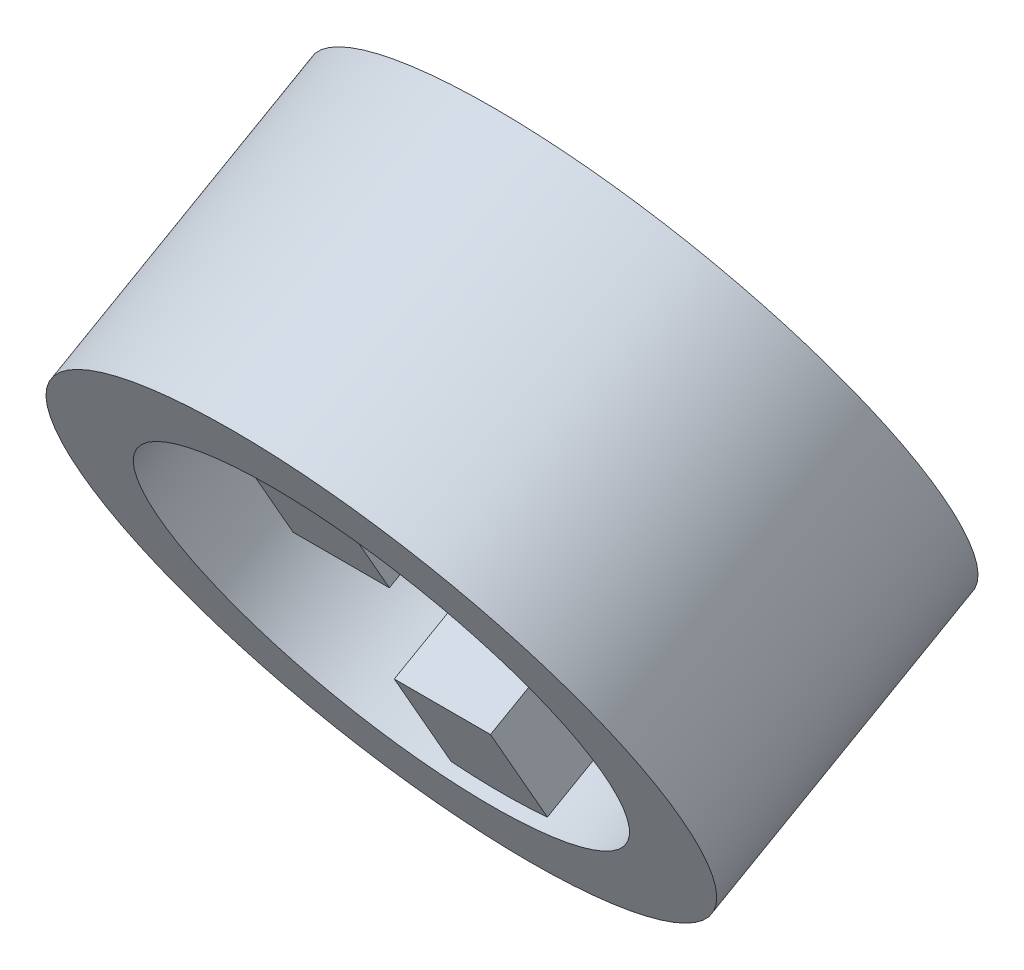
ISO-10303-21;
HEADER;
FILE_DESCRIPTION(('STEP AP214'),'2;1');
FILE_NAME('part.step','',(''),(''),'','','');
FILE_SCHEMA(('AUTOMOTIVE_DESIGN { 1 0 10303 214 1 1 1 1 }'));
ENDSEC;
DATA;
#1=APPLICATION_CONTEXT('core data for automotive mechanical design processes');
#2=APPLICATION_PROTOCOL_DEFINITION('international standard','automotive_design',2000,#1);
#3=PRODUCT_CONTEXT('',#1,'mechanical');
#4=PRODUCT('Part','Part','',(#3));
#5=PRODUCT_RELATED_PRODUCT_CATEGORY('part','',(#4));
#6=PRODUCT_DEFINITION_FORMATION('','',#4);
#7=PRODUCT_DEFINITION_CONTEXT('part definition',#1,'design');
#8=PRODUCT_DEFINITION('design','',#6,#7);
#9=PRODUCT_DEFINITION_SHAPE('','',#8);
#10=(LENGTH_UNIT() NAMED_UNIT(*) SI_UNIT(.MILLI.,.METRE.));
#11=(NAMED_UNIT(*) PLANE_ANGLE_UNIT() SI_UNIT($,.RADIAN.));
#12=(NAMED_UNIT(*) SI_UNIT($,.STERADIAN.) SOLID_ANGLE_UNIT());
#13=UNCERTAINTY_MEASURE_WITH_UNIT(LENGTH_MEASURE(1.E-05),#10,'distance_accuracy_value','');
#14=(GEOMETRIC_REPRESENTATION_CONTEXT(3) GLOBAL_UNCERTAINTY_ASSIGNED_CONTEXT((#13)) GLOBAL_UNIT_ASSIGNED_CONTEXT((#10,
#11,#12)) REPRESENTATION_CONTEXT('',''));
#15=CARTESIAN_POINT('',(0.,0.,0.));
#16=DIRECTION('',(0.,0.,1.));
#17=DIRECTION('',(1.,0.,0.));
#18=AXIS2_PLACEMENT_3D('',#15,#16,#17);
#19=CARTESIAN_POINT('',(-27.75,72.8418629992691,-22.5015725902753));
#20=DIRECTION('',(0.,0.494736971942381,-0.869042765687215));
#21=DIRECTION('',(0.,0.869042765687215,0.494736971942381));
#22=AXIS2_PLACEMENT_3D('',#19,#20,#21);
#23=PLANE('',#22);
#24=CARTESIAN_POINT('',(-27.75,72.8418629992691,-22.5015725902753));
#25=DIRECTION('',(0.,0.494736971942381,-0.869042765687215));
#26=DIRECTION('',(0.,0.869042765687215,0.494736971942381));
#27=AXIS2_PLACEMENT_3D('',#24,#25,#26);
#28=CIRCLE('',#27,5.00000000000002);
#29=CARTESIAN_POINT('',(-27.75,77.1870768277051,-20.0278877305634));
#30=VERTEX_POINT('',#29);
#31=EDGE_CURVE('E163',#30,#30,#28,.T.);
#32=ORIENTED_EDGE('',*,*,#31,.T.);
#33=EDGE_LOOP('',(#32));
#34=FACE_BOUND('',#33,.T.);
#35=DIRECTION('',(1.,0.,0.));
#36=VECTOR('',#35,1.);
#37=CARTESIAN_POINT('',(-27.75,71.3644902976009,-23.3426254425773));
#38=LINE('',#37,#36);
#39=CARTESIAN_POINT('',(-28.55,71.3644902976009,-23.3426254425773));
#40=VERTEX_POINT('',#39);
#41=CARTESIAN_POINT('',(-26.9499999999999,71.3644902976009,-23.3426254425773));
#42=VERTEX_POINT('',#41);
#43=EDGE_CURVE('E49',#40,#42,#38,.T.);
#44=ORIENTED_EDGE('',*,*,#43,.T.);
#45=DIRECTION('',(0.,-0.869042765687215,-0.494736971942381));
#46=VECTOR('',#45,1.);
#47=CARTESIAN_POINT('',(-26.9499999999999,72.8418629992691,-22.5015725902753));
#48=LINE('',#47,#46);
#49=CARTESIAN_POINT('',(-26.9499999999999,69.7024648024577,-24.2887992020561));
#50=VERTEX_POINT('',#49);
#51=EDGE_CURVE('E11',#42,#50,#48,.T.);
#52=ORIENTED_EDGE('',*,*,#51,.T.);
#53=CARTESIAN_POINT('',(-27.75,72.8418629992691,-22.5015725902753));
#54=DIRECTION('',(0.,0.494736971942381,-0.869042765687215));
#55=DIRECTION('',(0.,0.869042765687215,0.494736971942381));
#56=AXIS2_PLACEMENT_3D('',#53,#54,#55);
#57=CIRCLE('',#56,3.70000000000001);
#58=CARTESIAN_POINT('',(-26.9499999999999,75.9812611960804,-20.7143459784944));
#59=VERTEX_POINT('',#58);
#60=EDGE_CURVE('E64',#59,#50,#57,.T.);
#61=ORIENTED_EDGE('',*,*,#60,.F.);
#62=DIRECTION('',(0.,-0.869042765687215,-0.494736971942381));
#63=VECTOR('',#62,1.);
#64=CARTESIAN_POINT('',(-26.9499999999999,72.8418629992691,-22.5015725902753));
#65=LINE('',#64,#63);
#66=CARTESIAN_POINT('',(-26.9499999999999,74.3192357009374,-21.6605197379732));
#67=VERTEX_POINT('',#66);
#68=EDGE_CURVE('E167',#59,#67,#65,.T.);
#69=ORIENTED_EDGE('',*,*,#68,.T.);
#70=DIRECTION('',(-1.,0.,0.));
#71=VECTOR('',#70,1.);
#72=CARTESIAN_POINT('',(-27.75,74.3192357009374,-21.6605197379732));
#73=LINE('',#72,#71);
#74=CARTESIAN_POINT('',(-28.55,74.3192357009374,-21.6605197379732));
#75=VERTEX_POINT('',#74);
#76=EDGE_CURVE('E172',#67,#75,#73,.T.);
#77=ORIENTED_EDGE('',*,*,#76,.T.);
#78=DIRECTION('',(0.,0.869042765687215,0.494736971942381));
#79=VECTOR('',#78,1.);
#80=CARTESIAN_POINT('',(-28.55,72.8418629992691,-22.5015725902753));
#81=LINE('',#80,#79);
#82=CARTESIAN_POINT('',(-28.55,75.9812611960804,-20.7143459784944));
#83=VERTEX_POINT('',#82);
#84=EDGE_CURVE('E175',#75,#83,#81,.T.);
#85=ORIENTED_EDGE('',*,*,#84,.T.);
#86=CARTESIAN_POINT('',(-28.55,69.7024648024577,-24.2887992020561));
#87=VERTEX_POINT('',#86);
#88=EDGE_CURVE('E115',#87,#83,#57,.T.);
#89=ORIENTED_EDGE('',*,*,#88,.F.);
#90=DIRECTION('',(0.,0.869042765687215,0.494736971942381));
#91=VECTOR('',#90,1.);
#92=CARTESIAN_POINT('',(-28.55,72.8418629992691,-22.5015725902753));
#93=LINE('',#92,#91);
#94=EDGE_CURVE('E178',#87,#40,#93,.T.);
#95=ORIENTED_EDGE('',*,*,#94,.T.);
#96=EDGE_LOOP('',(#44,#52,#61,#69,#77,#85,#89,#95));
#97=FACE_BOUND('',#96,.T.);
#98=ADVANCED_FACE('F41',(#34,#97),#23,.T.);
#99=CARTESIAN_POINT('',(-27.75,70.3681781395572,-18.1563587618392));
#100=DIRECTION('',(0.,0.494736971942381,-0.869042765687215));
#101=DIRECTION('',(0.,0.869042765687215,0.494736971942381));
#102=AXIS2_PLACEMENT_3D('',#99,#100,#101);
#103=CYLINDRICAL_SURFACE('',#102,5.00000000000002);
#104=CARTESIAN_POINT('',(-27.75,70.3681781395572,-18.1563587618392));
#105=DIRECTION('',(0.,0.494736971942381,-0.869042765687215));
#106=DIRECTION('',(0.,0.869042765687215,0.494736971942381));
#107=AXIS2_PLACEMENT_3D('',#104,#105,#106);
#108=CIRCLE('',#107,5.00000000000002);
#109=CARTESIAN_POINT('',(-27.75,74.7133919679932,-15.6826739021273));
#110=VERTEX_POINT('',#109);
#111=EDGE_CURVE('E164',#110,#110,#108,.T.);
#112=ORIENTED_EDGE('',*,*,#111,.T.);
#113=EDGE_LOOP('',(#112));
#114=FACE_BOUND('',#113,.T.);
#115=ORIENTED_EDGE('',*,*,#31,.F.);
#116=EDGE_LOOP('',(#115));
#117=FACE_BOUND('',#116,.T.);
#118=ADVANCED_FACE('F43',(#114,#117),#103,.T.);
#119=CARTESIAN_POINT('',(-27.75,70.3681781395572,-18.1563587618392));
#120=DIRECTION('',(0.,0.494736971942381,-0.869042765687215));
#121=DIRECTION('',(0.,0.869042765687215,0.494736971942381));
#122=AXIS2_PLACEMENT_3D('',#119,#120,#121);
#123=PLANE('',#122);
#124=CARTESIAN_POINT('',(-27.75,70.3681781395572,-18.1563587618392));
#125=DIRECTION('',(0.,0.494736971942381,-0.869042765687215));
#126=DIRECTION('',(0.,0.869042765687215,0.494736971942381));
#127=AXIS2_PLACEMENT_3D('',#124,#125,#126);
#128=CIRCLE('',#127,3.70000000000001);
#129=CARTESIAN_POINT('',(-27.75,73.5836363725999,-16.3258319656524));
#130=VERTEX_POINT('',#129);
#131=EDGE_CURVE('E118',#130,#130,#128,.T.);
#132=ORIENTED_EDGE('',*,*,#131,.T.);
#133=EDGE_LOOP('',(#132));
#134=FACE_BOUND('',#133,.T.);
#135=ORIENTED_EDGE('',*,*,#111,.F.);
#136=EDGE_LOOP('',(#135));
#137=FACE_BOUND('',#136,.T.);
#138=ADVANCED_FACE('F202',(#134,#137),#123,.F.);
#139=CARTESIAN_POINT('',(-27.75,70.3681781395572,-18.1563587618392));
#140=DIRECTION('',(0.,-0.494736971942381,0.869042765687215));
#141=DIRECTION('',(0.,-0.869042765687215,-0.494736971942381));
#142=AXIS2_PLACEMENT_3D('',#139,#140,#141);
#143=CYLINDRICAL_SURFACE('',#142,3.70000000000001);
#144=ORIENTED_EDGE('',*,*,#60,.T.);
#145=DIRECTION('',(0.,-0.494736971942381,0.869042765687215));
#146=VECTOR('',#145,1.);
#147=CARTESIAN_POINT('',(-26.9499999999999,67.3277273371343,-20.1173939267575));
#148=LINE('',#147,#146);
#149=CARTESIAN_POINT('',(-26.9499999999999,67.3277273371343,-20.1173939267575));
#150=VERTEX_POINT('',#149);
#151=EDGE_CURVE('E151',#150,#50,#148,.F.);
#152=ORIENTED_EDGE('',*,*,#151,.F.);
#153=CARTESIAN_POINT('',(-27.75,70.4671255339456,-18.3301673149766));
#154=DIRECTION('',(0.,0.494736971942381,-0.869042765687215));
#155=DIRECTION('',(0.,0.869042765687215,0.494736971942381));
#156=AXIS2_PLACEMENT_3D('',#153,#154,#155);
#157=CIRCLE('',#156,3.70000000000001);
#158=CARTESIAN_POINT('',(-28.55,67.3277273371343,-20.1173939267575));
#159=VERTEX_POINT('',#158);
#160=EDGE_CURVE('E133',#150,#159,#157,.T.);
#161=ORIENTED_EDGE('',*,*,#160,.T.);
#162=DIRECTION('',(0.,-0.494736971942381,0.869042765687215));
#163=VECTOR('',#162,1.);
#164=CARTESIAN_POINT('',(-28.55,67.3277273371343,-20.1173939267575));
#165=LINE('',#164,#163);
#166=EDGE_CURVE('E146',#159,#87,#165,.F.);
#167=ORIENTED_EDGE('',*,*,#166,.T.);
#168=ORIENTED_EDGE('',*,*,#88,.T.);
#169=DIRECTION('',(0.,-0.494736971942381,0.869042765687215));
#170=VECTOR('',#169,1.);
#171=CARTESIAN_POINT('',(-28.55,73.606523730757,-16.5429407031958));
#172=LINE('',#171,#170);
#173=CARTESIAN_POINT('',(-28.55,73.606523730757,-16.5429407031958));
#174=VERTEX_POINT('',#173);
#175=EDGE_CURVE('E106',#174,#83,#172,.F.);
#176=ORIENTED_EDGE('',*,*,#175,.F.);
#177=CARTESIAN_POINT('',(-27.75,70.4671255339456,-18.3301673149766));
#178=DIRECTION('',(0.,0.494736971942381,-0.869042765687215));
#179=DIRECTION('',(0.,0.869042765687215,0.494736971942381));
#180=AXIS2_PLACEMENT_3D('',#177,#178,#179);
#181=CIRCLE('',#180,3.70000000000001);
#182=CARTESIAN_POINT('',(-26.9499999999999,73.606523730757,-16.5429407031958));
#183=VERTEX_POINT('',#182);
#184=EDGE_CURVE('E111',#174,#183,#181,.T.);
#185=ORIENTED_EDGE('',*,*,#184,.T.);
#186=DIRECTION('',(0.,-0.494736971942381,0.869042765687215));
#187=VECTOR('',#186,1.);
#188=CARTESIAN_POINT('',(-26.9499999999999,73.606523730757,-16.5429407031958));
#189=LINE('',#188,#187);
#190=EDGE_CURVE('E128',#183,#59,#189,.F.);
#191=ORIENTED_EDGE('',*,*,#190,.T.);
#192=EDGE_LOOP('',(#144,#152,#161,#167,#168,#176,#185,#191));
#193=FACE_BOUND('',#192,.T.);
#194=ORIENTED_EDGE('',*,*,#131,.F.);
#195=EDGE_LOOP('',(#194));
#196=FACE_BOUND('',#195,.T.);
#197=ADVANCED_FACE('F108',(#193,#196),#143,.F.);
#198=CARTESIAN_POINT('',(-26.9499999999999,67.4533200904107,-19.8157570122075));
#199=DIRECTION('',(1.,0.,0.));
#200=DIRECTION('',(0.,0.,-1.));
#201=AXIS2_PLACEMENT_3D('',#198,#199,#200);
#202=PLANE('',#201);
#203=DIRECTION('',(0.,0.494736971942381,-0.869042765687215));
#204=VECTOR('',#203,1.);
#205=CARTESIAN_POINT('',(-26.9499999999999,68.890805437889,-18.9974116141412));
#206=LINE('',#205,#204);
#207=CARTESIAN_POINT('',(-26.9499999999999,68.9897528322774,-19.1712201672787));
#208=VERTEX_POINT('',#207);
#209=EDGE_CURVE('E147',#208,#42,#206,.T.);
#210=ORIENTED_EDGE('',*,*,#209,.F.);
#211=DIRECTION('',(0.,-0.869042765687215,-0.494736971942381));
#212=VECTOR('',#211,1.);
#213=CARTESIAN_POINT('',(-26.9499999999999,70.4671255339456,-18.3301673149766));
#214=LINE('',#213,#212);
#215=EDGE_CURVE('E142',#208,#150,#214,.T.);
#216=ORIENTED_EDGE('',*,*,#215,.T.);
#217=ORIENTED_EDGE('',*,*,#151,.T.);
#218=ORIENTED_EDGE('',*,*,#51,.F.);
#219=EDGE_LOOP('',(#210,#216,#217,#218));
#220=FACE_BOUND('',#219,.T.);
#221=ADVANCED_FACE('F193',(#220),#202,.T.);
#222=CARTESIAN_POINT('',(-26.75,68.890805437889,-18.9974116141412));
#223=DIRECTION('',(0.,0.869042765687215,0.494736971942381));
#224=DIRECTION('',(0.,-0.494736971942381,0.869042765687215));
#225=AXIS2_PLACEMENT_3D('',#222,#223,#224);
#226=PLANE('',#225);
#227=DIRECTION('',(0.,0.494736971942381,-0.869042765687215));
#228=VECTOR('',#227,1.);
#229=CARTESIAN_POINT('',(-28.55,68.890805437889,-18.9974116141412));
#230=LINE('',#229,#228);
#231=CARTESIAN_POINT('',(-28.55,68.9897528322774,-19.1712201672787));
#232=VERTEX_POINT('',#231);
#233=EDGE_CURVE('E150',#232,#40,#230,.T.);
#234=ORIENTED_EDGE('',*,*,#233,.F.);
#235=DIRECTION('',(1.,0.,0.));
#236=VECTOR('',#235,1.);
#237=CARTESIAN_POINT('',(-27.75,68.9897528322774,-19.1712201672787));
#238=LINE('',#237,#236);
#239=EDGE_CURVE('E145',#232,#208,#238,.T.);
#240=ORIENTED_EDGE('',*,*,#239,.T.);
#241=ORIENTED_EDGE('',*,*,#209,.T.);
#242=ORIENTED_EDGE('',*,*,#43,.F.);
#243=EDGE_LOOP('',(#234,#240,#241,#242));
#244=FACE_BOUND('',#243,.T.);
#245=ADVANCED_FACE('F183',(#244),#226,.T.);
#246=CARTESIAN_POINT('',(-28.55,67.4533200904107,-19.8157570122075));
#247=DIRECTION('',(-1.,0.,0.));
#248=DIRECTION('',(0.,-1.,0.));
#249=AXIS2_PLACEMENT_3D('',#246,#247,#248);
#250=PLANE('',#249);
#251=ORIENTED_EDGE('',*,*,#166,.F.);
#252=DIRECTION('',(0.,0.869042765687215,0.494736971942381));
#253=VECTOR('',#252,1.);
#254=CARTESIAN_POINT('',(-28.55,70.4671255339456,-18.3301673149766));
#255=LINE('',#254,#253);
#256=EDGE_CURVE('E137',#159,#232,#255,.T.);
#257=ORIENTED_EDGE('',*,*,#256,.T.);
#258=ORIENTED_EDGE('',*,*,#233,.T.);
#259=ORIENTED_EDGE('',*,*,#94,.F.);
#260=EDGE_LOOP('',(#251,#257,#258,#259));
#261=FACE_BOUND('',#260,.T.);
#262=ADVANCED_FACE('F187',(#261),#250,.T.);
#263=CARTESIAN_POINT('',(-27.75,70.4671255339456,-18.3301673149766));
#264=DIRECTION('',(0.,0.494736971942381,-0.869042765687215));
#265=DIRECTION('',(0.,0.869042765687215,0.494736971942381));
#266=AXIS2_PLACEMENT_3D('',#263,#264,#265);
#267=PLANE('',#266);
#268=ORIENTED_EDGE('',*,*,#160,.F.);
#269=ORIENTED_EDGE('',*,*,#215,.F.);
#270=ORIENTED_EDGE('',*,*,#239,.F.);
#271=ORIENTED_EDGE('',*,*,#256,.F.);
#272=EDGE_LOOP('',(#268,#269,#270,#271));
#273=FACE_BOUND('',#272,.T.);
#274=ADVANCED_FACE('F190',(#273),#267,.F.);
#275=CARTESIAN_POINT('',(-28.55,73.2830361887038,-16.4969605114708));
#276=DIRECTION('',(-1.,0.,0.));
#277=DIRECTION('',(0.,0.,1.));
#278=AXIS2_PLACEMENT_3D('',#275,#276,#277);
#279=PLANE('',#278);
#280=DIRECTION('',(0.,0.494736971942381,-0.869042765687215));
#281=VECTOR('',#280,1.);
#282=CARTESIAN_POINT('',(-28.55,71.8455508412255,-17.3153059095371));
#283=LINE('',#282,#281);
#284=CARTESIAN_POINT('',(-28.55,71.9444982356139,-17.4891144626746));
#285=VERTEX_POINT('',#284);
#286=EDGE_CURVE('E119',#285,#75,#283,.T.);
#287=ORIENTED_EDGE('',*,*,#286,.F.);
#288=DIRECTION('',(0.,0.869042765687215,0.494736971942381));
#289=VECTOR('',#288,1.);
#290=CARTESIAN_POINT('',(-28.55,70.4671255339456,-18.3301673149766));
#291=LINE('',#290,#289);
#292=EDGE_CURVE('E122',#285,#174,#291,.T.);
#293=ORIENTED_EDGE('',*,*,#292,.T.);
#294=ORIENTED_EDGE('',*,*,#175,.T.);
#295=ORIENTED_EDGE('',*,*,#84,.F.);
#296=EDGE_LOOP('',(#287,#293,#294,#295));
#297=FACE_BOUND('',#296,.T.);
#298=ADVANCED_FACE('F123',(#297),#279,.T.);
#299=CARTESIAN_POINT('',(-26.75,71.8455508412255,-17.3153059095371));
#300=DIRECTION('',(0.,-0.869042765687215,-0.494736971942381));
#301=DIRECTION('',(0.,0.494736971942381,-0.869042765687215));
#302=AXIS2_PLACEMENT_3D('',#299,#300,#301);
#303=PLANE('',#302);
#304=DIRECTION('',(0.,0.494736971942381,-0.869042765687215));
#305=VECTOR('',#304,1.);
#306=CARTESIAN_POINT('',(-26.9499999999999,71.8455508412255,-17.3153059095371));
#307=LINE('',#306,#305);
#308=CARTESIAN_POINT('',(-26.9499999999999,71.9444982356139,-17.4891144626746));
#309=VERTEX_POINT('',#308);
#310=EDGE_CURVE('E56',#309,#67,#307,.T.);
#311=ORIENTED_EDGE('',*,*,#310,.F.);
#312=DIRECTION('',(-1.,0.,0.));
#313=VECTOR('',#312,1.);
#314=CARTESIAN_POINT('',(-27.75,71.9444982356139,-17.4891144626746));
#315=LINE('',#314,#313);
#316=EDGE_CURVE('E129',#309,#285,#315,.T.);
#317=ORIENTED_EDGE('',*,*,#316,.T.);
#318=ORIENTED_EDGE('',*,*,#286,.T.);
#319=ORIENTED_EDGE('',*,*,#76,.F.);
#320=EDGE_LOOP('',(#311,#317,#318,#319));
#321=FACE_BOUND('',#320,.T.);
#322=ADVANCED_FACE('F220',(#321),#303,.T.);
#323=CARTESIAN_POINT('',(-26.9499999999999,73.2830361887038,-16.4969605114708));
#324=DIRECTION('',(1.,0.,0.));
#325=DIRECTION('',(0.,0.,-1.));
#326=AXIS2_PLACEMENT_3D('',#323,#324,#325);
#327=PLANE('',#326);
#328=ORIENTED_EDGE('',*,*,#190,.F.);
#329=DIRECTION('',(0.,-0.869042765687215,-0.494736971942381));
#330=VECTOR('',#329,1.);
#331=CARTESIAN_POINT('',(-26.9499999999999,70.4671255339456,-18.3301673149766));
#332=LINE('',#331,#330);
#333=EDGE_CURVE('E132',#183,#309,#332,.T.);
#334=ORIENTED_EDGE('',*,*,#333,.T.);
#335=ORIENTED_EDGE('',*,*,#310,.T.);
#336=ORIENTED_EDGE('',*,*,#68,.F.);
#337=EDGE_LOOP('',(#328,#334,#335,#336));
#338=FACE_BOUND('',#337,.T.);
#339=ADVANCED_FACE('F217',(#338),#327,.T.);
#340=CARTESIAN_POINT('',(-27.75,70.4671255339456,-18.3301673149766));
#341=DIRECTION('',(0.,0.494736971942381,-0.869042765687215));
#342=DIRECTION('',(0.,0.869042765687215,0.494736971942381));
#343=AXIS2_PLACEMENT_3D('',#340,#341,#342);
#344=PLANE('',#343);
#345=ORIENTED_EDGE('',*,*,#184,.F.);
#346=ORIENTED_EDGE('',*,*,#292,.F.);
#347=ORIENTED_EDGE('',*,*,#316,.F.);
#348=ORIENTED_EDGE('',*,*,#333,.F.);
#349=EDGE_LOOP('',(#345,#346,#347,#348));
#350=FACE_BOUND('',#349,.T.);
#351=ADVANCED_FACE('F131',(#350),#344,.F.);
#352=CLOSED_SHELL('',(#98,#118,#138,#197,#221,#245,#262,#274,#298,#322,#339,#351));
#353=MANIFOLD_SOLID_BREP('B2',#352);
#354=ADVANCED_BREP_SHAPE_REPRESENTATION('',(#18,#353),#14);
#355=SHAPE_DEFINITION_REPRESENTATION(#9,#354);
ENDSEC;
END-ISO-10303-21;
